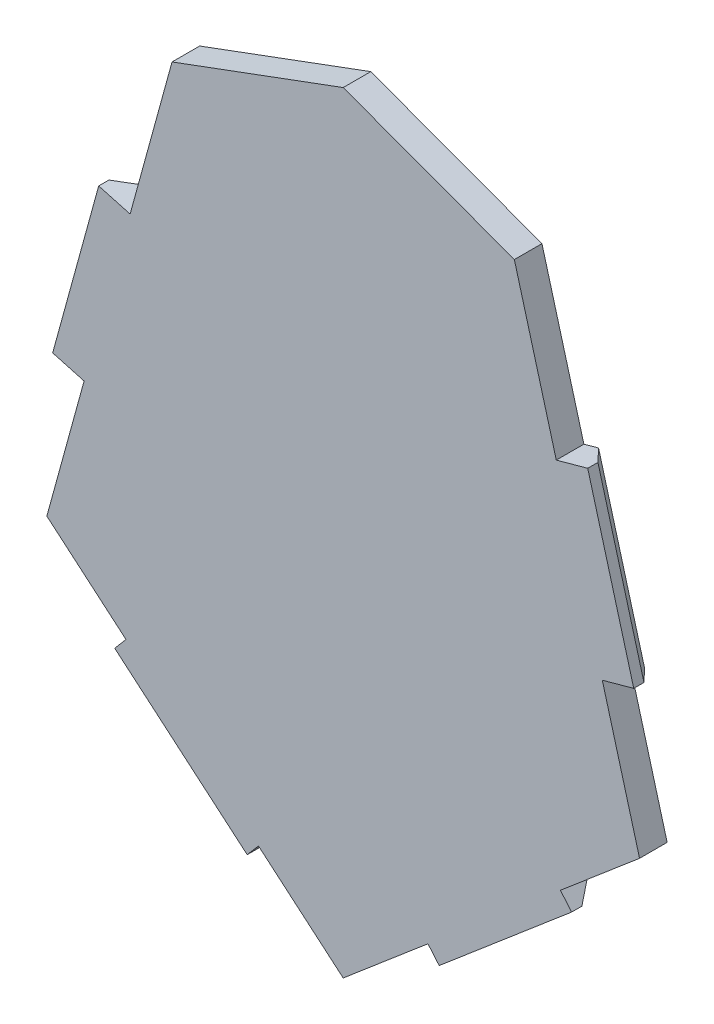
ISO-10303-21;
HEADER;
FILE_DESCRIPTION(('STEP AP214'),'2;1');
FILE_NAME('part.step','',(''),(''),'','','');
FILE_SCHEMA(('AUTOMOTIVE_DESIGN { 1 0 10303 214 1 1 1 1 }'));
ENDSEC;
DATA;
#1=APPLICATION_CONTEXT('core data for automotive mechanical design processes');
#2=APPLICATION_PROTOCOL_DEFINITION('international standard','automotive_design',2000,#1);
#3=PRODUCT_CONTEXT('',#1,'mechanical');
#4=PRODUCT('Part','Part','',(#3));
#5=PRODUCT_RELATED_PRODUCT_CATEGORY('part','',(#4));
#6=PRODUCT_DEFINITION_FORMATION('','',#4);
#7=PRODUCT_DEFINITION_CONTEXT('part definition',#1,'design');
#8=PRODUCT_DEFINITION('design','',#6,#7);
#9=PRODUCT_DEFINITION_SHAPE('','',#8);
#10=(LENGTH_UNIT() NAMED_UNIT(*) SI_UNIT(.MILLI.,.METRE.));
#11=(NAMED_UNIT(*) PLANE_ANGLE_UNIT() SI_UNIT($,.RADIAN.));
#12=(NAMED_UNIT(*) SI_UNIT($,.STERADIAN.) SOLID_ANGLE_UNIT());
#13=UNCERTAINTY_MEASURE_WITH_UNIT(LENGTH_MEASURE(1.E-05),#10,'distance_accuracy_value','');
#14=(GEOMETRIC_REPRESENTATION_CONTEXT(3) GLOBAL_UNCERTAINTY_ASSIGNED_CONTEXT((#13)) GLOBAL_UNIT_ASSIGNED_CONTEXT((#10,
#11,#12)) REPRESENTATION_CONTEXT('',''));
#15=CARTESIAN_POINT('',(0.,0.,0.));
#16=DIRECTION('',(0.,0.,1.));
#17=DIRECTION('',(1.,0.,0.));
#18=AXIS2_PLACEMENT_3D('',#15,#16,#17);
#19=CARTESIAN_POINT('',(15.7629121579827,-18.550858767251,3.175));
#20=DIRECTION('',(-0.647521590440071,0.762047104786811,0.));
#21=DIRECTION('',(-0.762047104786811,-0.647521590440071,0.));
#22=AXIS2_PLACEMENT_3D('',#19,#20,#21);
#23=PLANE('',#22);
#24=DIRECTION('',(0.762047104786811,0.647521590440071,0.));
#25=VECTOR('',#24,1.);
#26=CARTESIAN_POINT('',(15.7629121579827,-18.550858767251,3.175));
#27=LINE('',#26,#25);
#28=CARTESIAN_POINT('',(24.9920826937992,-10.7087094483235,3.175));
#29=VERTEX_POINT('',#28);
#30=CARTESIAN_POINT('',(34.0985455960016,-2.97082644256468,3.175));
#31=VERTEX_POINT('',#30);
#32=EDGE_CURVE('E530',#29,#31,#27,.T.);
#33=ORIENTED_EDGE('',*,*,#32,.F.);
#34=DIRECTION('',(0.,0.,-1.));
#35=VECTOR('',#34,1.);
#36=CARTESIAN_POINT('',(24.9920826937992,-10.7087094483235,3.175));
#37=LINE('',#36,#35);
#38=CARTESIAN_POINT('',(24.9920826937992,-10.7087094483235,0.));
#39=VERTEX_POINT('',#38);
#40=EDGE_CURVE('E308',#29,#39,#37,.T.);
#41=ORIENTED_EDGE('',*,*,#40,.T.);
#42=DIRECTION('',(0.762047104786811,0.647521590440071,0.));
#43=VECTOR('',#42,1.);
#44=CARTESIAN_POINT('',(15.7629121579827,-18.550858767251,0.));
#45=LINE('',#44,#43);
#46=CARTESIAN_POINT('',(34.0985455960016,-2.97082644256468,0.));
#47=VERTEX_POINT('',#46);
#48=EDGE_CURVE('E419',#39,#47,#45,.T.);
#49=ORIENTED_EDGE('',*,*,#48,.T.);
#50=DIRECTION('',(0.,0.,-1.));
#51=VECTOR('',#50,1.);
#52=CARTESIAN_POINT('',(34.0985455960016,-2.97082644256468,3.175));
#53=LINE('',#52,#51);
#54=EDGE_CURVE('E465',#31,#47,#53,.T.);
#55=ORIENTED_EDGE('',*,*,#54,.F.);
#56=EDGE_LOOP('',(#33,#41,#49,#55));
#57=FACE_BOUND('',#56,.T.);
#58=ADVANCED_FACE('F115',(#57),#23,.F.);
#59=CARTESIAN_POINT('',(-34.5651579868878,9.49162994769097,3.175));
#60=DIRECTION('',(0.964303674148378,-0.264798836900653,0.));
#61=DIRECTION('',(0.264798836900653,0.964303674148378,0.));
#62=AXIS2_PLACEMENT_3D('',#59,#60,#61);
#63=PLANE('',#62);
#64=DIRECTION('',(0.,0.,-1.));
#65=VECTOR('',#64,1.);
#66=CARTESIAN_POINT('',(-28.1332603745069,32.914325349076,3.175));
#67=LINE('',#66,#65);
#68=CARTESIAN_POINT('',(-28.1332603745069,32.914325349076,3.175));
#69=VERTEX_POINT('',#68);
#70=CARTESIAN_POINT('',(-28.1332603745069,32.914325349076,2.));
#71=VERTEX_POINT('',#70);
#72=EDGE_CURVE('E385',#69,#71,#67,.T.);
#73=ORIENTED_EDGE('',*,*,#72,.T.);
#74=DIRECTION('',(-0.264798836900653,-0.964303674148378,0.));
#75=VECTOR('',#74,1.);
#76=CARTESIAN_POINT('',(-34.5651579868878,9.49162994769097,2.));
#77=LINE('',#76,#75);
#78=CARTESIAN_POINT('',(-33.42923711252,13.6282518661085,2.));
#79=VERTEX_POINT('',#78);
#80=EDGE_CURVE('E302',#71,#79,#77,.T.);
#81=ORIENTED_EDGE('',*,*,#80,.T.);
#82=DIRECTION('',(0.,0.,-1.));
#83=VECTOR('',#82,1.);
#84=CARTESIAN_POINT('',(-33.42923711252,13.6282518661085,3.175));
#85=LINE('',#84,#83);
#86=CARTESIAN_POINT('',(-33.42923711252,13.6282518661085,3.175));
#87=VERTEX_POINT('',#86);
#88=EDGE_CURVE('E280',#87,#79,#85,.T.);
#89=ORIENTED_EDGE('',*,*,#88,.F.);
#90=DIRECTION('',(-0.264798836900653,-0.964303674148378,0.));
#91=VECTOR('',#90,1.);
#92=CARTESIAN_POINT('',(-34.5651579868878,9.49162994769097,3.175));
#93=LINE('',#92,#91);
#94=EDGE_CURVE('E287',#69,#87,#93,.T.);
#95=ORIENTED_EDGE('',*,*,#94,.F.);
#96=EDGE_LOOP('',(#73,#81,#89,#95));
#97=FACE_BOUND('',#96,.T.);
#98=ADVANCED_FACE('F300',(#97),#63,.F.);
#99=CARTESIAN_POINT('',(1.1359208743678,4.13662191841753,3.175));
#100=DIRECTION('',(0.264798836900652,0.964303674148378,0.));
#101=DIRECTION('',(-0.964303674148378,0.264798836900652,0.));
#102=AXIS2_PLACEMENT_3D('',#99,#100,#101);
#103=PLANE('',#102);
#104=ORIENTED_EDGE('',*,*,#88,.T.);
#105=DIRECTION('',(-0.681865667113421,0.187241053222761,0.707106781186548));
#106=VECTOR('',#105,1.);
#107=CARTESIAN_POINT('',(-33.42923711252,13.6282518661085,2.));
#108=LINE('',#107,#106);
#109=CARTESIAN_POINT('',(-31.5006297642232,13.0986541923072,0.));
#110=VERTEX_POINT('',#109);
#111=EDGE_CURVE('E373',#79,#110,#108,.F.);
#112=ORIENTED_EDGE('',*,*,#111,.T.);
#113=DIRECTION('',(0.964303674148378,-0.264798836900652,0.));
#114=VECTOR('',#113,1.);
#115=CARTESIAN_POINT('',(1.1359208743678,4.13662191841753,0.));
#116=LINE('',#115,#114);
#117=CARTESIAN_POINT('',(-29.8130983344636,12.635256227731,0.));
#118=VERTEX_POINT('',#117);
#119=EDGE_CURVE('E335',#110,#118,#116,.T.);
#120=ORIENTED_EDGE('',*,*,#119,.T.);
#121=DIRECTION('',(0.,0.,-1.));
#122=VECTOR('',#121,1.);
#123=CARTESIAN_POINT('',(-29.8130983344636,12.635256227731,3.175));
#124=LINE('',#123,#122);
#125=CARTESIAN_POINT('',(-29.8130983344636,12.635256227731,3.175));
#126=VERTEX_POINT('',#125);
#127=EDGE_CURVE('E282',#126,#118,#124,.T.);
#128=ORIENTED_EDGE('',*,*,#127,.F.);
#129=DIRECTION('',(0.964303674148378,-0.264798836900652,0.));
#130=VECTOR('',#129,1.);
#131=CARTESIAN_POINT('',(1.1359208743678,4.13662191841753,3.175));
#132=LINE('',#131,#130);
#133=EDGE_CURVE('E276',#87,#126,#132,.T.);
#134=ORIENTED_EDGE('',*,*,#133,.F.);
#135=EDGE_LOOP('',(#104,#112,#120,#128,#134));
#136=FACE_BOUND('',#135,.T.);
#137=ADVANCED_FACE('F278',(#136),#103,.F.);
#138=CARTESIAN_POINT('',(-30.9490192088314,8.49863430931353,3.175));
#139=DIRECTION('',(0.964303674148378,-0.264798836900653,0.));
#140=DIRECTION('',(0.264798836900653,0.964303674148378,0.));
#141=AXIS2_PLACEMENT_3D('',#138,#139,#140);
#142=PLANE('',#141);
#143=DIRECTION('',(-0.264798836900653,-0.964303674148378,0.));
#144=VECTOR('',#143,1.);
#145=CARTESIAN_POINT('',(-30.9490192088314,8.49863430931353,0.));
#146=LINE('',#145,#144);
#147=CARTESIAN_POINT('',(-34.0985455960013,-2.97082644256537,0.));
#148=VERTEX_POINT('',#147);
#149=EDGE_CURVE('E400',#118,#148,#146,.T.);
#150=ORIENTED_EDGE('',*,*,#149,.T.);
#151=DIRECTION('',(0.,0.,-1.));
#152=VECTOR('',#151,1.);
#153=CARTESIAN_POINT('',(-34.0985455960013,-2.97082644256537,3.175));
#154=LINE('',#153,#152);
#155=CARTESIAN_POINT('',(-34.0985455960013,-2.97082644256537,3.175));
#156=VERTEX_POINT('',#155);
#157=EDGE_CURVE('E310',#156,#148,#154,.T.);
#158=ORIENTED_EDGE('',*,*,#157,.F.);
#159=DIRECTION('',(-0.264798836900653,-0.964303674148378,0.));
#160=VECTOR('',#159,1.);
#161=CARTESIAN_POINT('',(-30.9490192088314,8.49863430931353,3.175));
#162=LINE('',#161,#160);
#163=EDGE_CURVE('E286',#126,#156,#162,.T.);
#164=ORIENTED_EDGE('',*,*,#163,.F.);
#165=ORIENTED_EDGE('',*,*,#127,.T.);
#166=EDGE_LOOP('',(#150,#158,#164,#165));
#167=FACE_BOUND('',#166,.T.);
#168=ADVANCED_FACE('F648',(#167),#142,.F.);
#169=CARTESIAN_POINT('',(-15.7629121579826,-18.5508587672513,3.175));
#170=DIRECTION('',(0.647521590440065,0.762047104786816,0.));
#171=DIRECTION('',(-0.762047104786816,0.647521590440065,0.));
#172=AXIS2_PLACEMENT_3D('',#169,#170,#171);
#173=PLANE('',#172);
#174=DIRECTION('',(0.762047104786816,-0.647521590440065,0.));
#175=VECTOR('',#174,1.);
#176=CARTESIAN_POINT('',(-15.7629121579826,-18.5508587672513,0.));
#177=LINE('',#176,#175);
#178=CARTESIAN_POINT('',(-24.9920826937988,-10.7087094483241,0.));
#179=VERTEX_POINT('',#178);
#180=EDGE_CURVE('E404',#148,#179,#177,.T.);
#181=ORIENTED_EDGE('',*,*,#180,.T.);
#182=DIRECTION('',(0.,0.,-1.));
#183=VECTOR('',#182,1.);
#184=CARTESIAN_POINT('',(-24.9920826937988,-10.7087094483241,3.175));
#185=LINE('',#184,#183);
#186=CARTESIAN_POINT('',(-24.9920826937988,-10.7087094483241,3.175));
#187=VERTEX_POINT('',#186);
#188=EDGE_CURVE('E485',#187,#179,#185,.T.);
#189=ORIENTED_EDGE('',*,*,#188,.F.);
#190=DIRECTION('',(0.762047104786816,-0.647521590440065,0.));
#191=VECTOR('',#190,1.);
#192=CARTESIAN_POINT('',(-15.7629121579826,-18.5508587672513,3.175));
#193=LINE('',#192,#191);
#194=EDGE_CURVE('E495',#156,#187,#193,.T.);
#195=ORIENTED_EDGE('',*,*,#194,.F.);
#196=ORIENTED_EDGE('',*,*,#157,.T.);
#197=EDGE_LOOP('',(#181,#189,#195,#196));
#198=FACE_BOUND('',#197,.T.);
#199=ADVANCED_FACE('F493',(#198),#173,.F.);
#200=CARTESIAN_POINT('',(-9.22917053581629,7.84214931892713,3.175));
#201=DIRECTION('',(0.762047104786818,-0.647521590440063,0.));
#202=DIRECTION('',(0.647521590440063,0.762047104786818,0.));
#203=AXIS2_PLACEMENT_3D('',#200,#201,#202);
#204=PLANE('',#203);
#205=ORIENTED_EDGE('',*,*,#188,.T.);
#206=DIRECTION('',(0.457866907564868,0.538848675378336,-0.707106781186546));
#207=VECTOR('',#206,1.);
#208=CARTESIAN_POINT('',(-26.287125874679,-12.2328036578978,1.99999999999999));
#209=LINE('',#208,#207);
#210=CARTESIAN_POINT('',(-26.287125874679,-12.2328036578979,2.));
#211=VERTEX_POINT('',#210);
#212=EDGE_CURVE('E368',#179,#211,#209,.F.);
#213=ORIENTED_EDGE('',*,*,#212,.T.);
#214=DIRECTION('',(0.,0.,-1.));
#215=VECTOR('',#214,1.);
#216=CARTESIAN_POINT('',(-26.287125874679,-12.2328036578979,3.175));
#217=LINE('',#216,#215);
#218=CARTESIAN_POINT('',(-26.287125874679,-12.2328036578979,3.175));
#219=VERTEX_POINT('',#218);
#220=EDGE_CURVE('E481',#219,#211,#217,.T.);
#221=ORIENTED_EDGE('',*,*,#220,.F.);
#222=DIRECTION('',(-0.647521590440063,-0.762047104786818,0.));
#223=VECTOR('',#222,1.);
#224=CARTESIAN_POINT('',(-9.22917053581629,7.84214931892713,3.175));
#225=LINE('',#224,#223);
#226=EDGE_CURVE('E516',#187,#219,#225,.T.);
#227=ORIENTED_EDGE('',*,*,#226,.F.);
#228=EDGE_LOOP('',(#205,#213,#221,#227));
#229=FACE_BOUND('',#228,.T.);
#230=ADVANCED_FACE('F506',(#229),#204,.F.);
#231=CARTESIAN_POINT('',(-17.0579553388627,-20.074952976825,3.175));
#232=DIRECTION('',(0.647521590440062,0.762047104786819,0.));
#233=DIRECTION('',(-0.762047104786819,0.647521590440062,0.));
#234=AXIS2_PLACEMENT_3D('',#231,#232,#233);
#235=PLANE('',#234);
#236=ORIENTED_EDGE('',*,*,#220,.T.);
#237=DIRECTION('',(0.762047104786819,-0.647521590440062,0.));
#238=VECTOR('',#237,1.);
#239=CARTESIAN_POINT('',(-17.0579553388627,-20.074952976825,2.));
#240=LINE('',#239,#238);
#241=CARTESIAN_POINT('',(-11.0461837789427,-25.1832354666991,2.));
#242=VERTEX_POINT('',#241);
#243=EDGE_CURVE('E361',#211,#242,#240,.T.);
#244=ORIENTED_EDGE('',*,*,#243,.T.);
#245=DIRECTION('',(0.,0.,-1.));
#246=VECTOR('',#245,1.);
#247=CARTESIAN_POINT('',(-11.0461837789427,-25.1832354666991,3.175));
#248=LINE('',#247,#246);
#249=CARTESIAN_POINT('',(-11.0461837789427,-25.1832354666991,3.175));
#250=VERTEX_POINT('',#249);
#251=EDGE_CURVE('E477',#250,#242,#248,.T.);
#252=ORIENTED_EDGE('',*,*,#251,.F.);
#253=DIRECTION('',(0.762047104786819,-0.647521590440062,0.));
#254=VECTOR('',#253,1.);
#255=CARTESIAN_POINT('',(-17.0579553388627,-20.074952976825,3.175));
#256=LINE('',#255,#254);
#257=EDGE_CURVE('E512',#219,#250,#256,.T.);
#258=ORIENTED_EDGE('',*,*,#257,.F.);
#259=EDGE_LOOP('',(#236,#244,#252,#258));
#260=FACE_BOUND('',#259,.T.);
#261=ADVANCED_FACE('F510',(#260),#235,.F.);
#262=CARTESIAN_POINT('',(6.01177155992005,-5.10828248987412,3.175));
#263=DIRECTION('',(-0.762047104786818,0.647521590440063,0.));
#264=DIRECTION('',(-0.647521590440063,-0.762047104786818,0.));
#265=AXIS2_PLACEMENT_3D('',#262,#263,#264);
#266=PLANE('',#265);
#267=ORIENTED_EDGE('',*,*,#251,.T.);
#268=DIRECTION('',(-0.457866907564868,-0.538848675378336,0.707106781186546));
#269=VECTOR('',#268,1.);
#270=CARTESIAN_POINT('',(-11.0461837789427,-25.1832354666991,2.00000000000001));
#271=LINE('',#270,#269);
#272=CARTESIAN_POINT('',(-9.75114059806253,-23.6591412571254,0.));
#273=VERTEX_POINT('',#272);
#274=EDGE_CURVE('E365',#242,#273,#271,.F.);
#275=ORIENTED_EDGE('',*,*,#274,.T.);
#276=DIRECTION('',(0.,0.,-1.));
#277=VECTOR('',#276,1.);
#278=CARTESIAN_POINT('',(-9.75114059806253,-23.6591412571254,3.175));
#279=LINE('',#278,#277);
#280=CARTESIAN_POINT('',(-9.75114059806253,-23.6591412571254,3.175));
#281=VERTEX_POINT('',#280);
#282=EDGE_CURVE('E473',#281,#273,#279,.T.);
#283=ORIENTED_EDGE('',*,*,#282,.F.);
#284=DIRECTION('',(0.647521590440063,0.762047104786818,0.));
#285=VECTOR('',#284,1.);
#286=CARTESIAN_POINT('',(6.01177155992005,-5.10828248987412,3.175));
#287=LINE('',#286,#285);
#288=EDGE_CURVE('E515',#250,#281,#287,.T.);
#289=ORIENTED_EDGE('',*,*,#288,.F.);
#290=EDGE_LOOP('',(#267,#275,#283,#289));
#291=FACE_BOUND('',#290,.T.);
#292=ADVANCED_FACE('F665',(#291),#266,.F.);
#293=CARTESIAN_POINT('',(0.,-31.944815500883,0.));
#294=VERTEX_POINT('',#293);
#295=EDGE_CURVE('E413',#273,#294,#177,.T.);
#296=ORIENTED_EDGE('',*,*,#295,.T.);
#297=DIRECTION('',(0.,0.,-1.));
#298=VECTOR('',#297,1.);
#299=CARTESIAN_POINT('',(0.,-31.944815500883,3.175));
#300=LINE('',#299,#298);
#301=CARTESIAN_POINT('',(0.,-31.944815500883,3.175));
#302=VERTEX_POINT('',#301);
#303=EDGE_CURVE('E469',#302,#294,#300,.T.);
#304=ORIENTED_EDGE('',*,*,#303,.F.);
#305=EDGE_CURVE('E520',#281,#302,#193,.T.);
#306=ORIENTED_EDGE('',*,*,#305,.F.);
#307=ORIENTED_EDGE('',*,*,#282,.T.);
#308=EDGE_LOOP('',(#296,#304,#306,#307));
#309=FACE_BOUND('',#308,.T.);
#310=ADVANCED_FACE('F608',(#309),#173,.F.);
#311=CARTESIAN_POINT('',(9.75114059806294,-23.659141257125,0.));
#312=VERTEX_POINT('',#311);
#313=EDGE_CURVE('E414',#294,#312,#45,.T.);
#314=ORIENTED_EDGE('',*,*,#313,.T.);
#315=DIRECTION('',(0.,0.,1.));
#316=VECTOR('',#315,1.);
#317=CARTESIAN_POINT('',(9.75114059806294,-23.659141257125,3.175));
#318=LINE('',#317,#316);
#319=CARTESIAN_POINT('',(9.75114059806294,-23.659141257125,3.175));
#320=VERTEX_POINT('',#319);
#321=EDGE_CURVE('E304',#312,#320,#318,.T.);
#322=ORIENTED_EDGE('',*,*,#321,.T.);
#323=EDGE_CURVE('E525',#302,#320,#27,.T.);
#324=ORIENTED_EDGE('',*,*,#323,.F.);
#325=ORIENTED_EDGE('',*,*,#303,.T.);
#326=EDGE_LOOP('',(#314,#322,#324,#325));
#327=FACE_BOUND('',#326,.T.);
#328=ADVANCED_FACE('F612',(#327),#23,.F.);
#329=CARTESIAN_POINT('',(30.9490192088316,8.49863430931387,3.175));
#330=DIRECTION('',(-0.964303674148376,-0.264798836900661,0.));
#331=DIRECTION('',(0.264798836900661,-0.964303674148376,0.));
#332=AXIS2_PLACEMENT_3D('',#329,#330,#331);
#333=PLANE('',#332);
#334=DIRECTION('',(-0.264798836900661,0.964303674148376,0.));
#335=VECTOR('',#334,1.);
#336=CARTESIAN_POINT('',(30.9490192088316,8.49863430931387,0.));
#337=LINE('',#336,#335);
#338=CARTESIAN_POINT('',(29.8130983344639,12.6352562277311,0.));
#339=VERTEX_POINT('',#338);
#340=EDGE_CURVE('E418',#47,#339,#337,.T.);
#341=ORIENTED_EDGE('',*,*,#340,.T.);
#342=DIRECTION('',(0.,0.,-1.));
#343=VECTOR('',#342,1.);
#344=CARTESIAN_POINT('',(29.8130983344639,12.6352562277311,3.175));
#345=LINE('',#344,#343);
#346=CARTESIAN_POINT('',(29.8130983344639,12.6352562277311,3.175));
#347=VERTEX_POINT('',#346);
#348=EDGE_CURVE('E461',#347,#339,#345,.T.);
#349=ORIENTED_EDGE('',*,*,#348,.F.);
#350=DIRECTION('',(-0.264798836900661,0.964303674148376,0.));
#351=VECTOR('',#350,1.);
#352=CARTESIAN_POINT('',(30.9490192088316,8.49863430931387,3.175));
#353=LINE('',#352,#351);
#354=EDGE_CURVE('E529',#31,#347,#353,.T.);
#355=ORIENTED_EDGE('',*,*,#354,.F.);
#356=ORIENTED_EDGE('',*,*,#54,.T.);
#357=EDGE_LOOP('',(#341,#349,#355,#356));
#358=FACE_BOUND('',#357,.T.);
#359=ADVANCED_FACE('F576',(#358),#333,.F.);
#360=CARTESIAN_POINT('',(-1.13592087436775,4.13662191841722,3.175));
#361=DIRECTION('',(0.264798836900661,-0.964303674148376,0.));
#362=DIRECTION('',(0.964303674148376,0.264798836900661,0.));
#363=AXIS2_PLACEMENT_3D('',#360,#361,#362);
#364=PLANE('',#363);
#365=DIRECTION('',(-0.964303674148376,-0.264798836900661,0.));
#366=VECTOR('',#365,1.);
#367=CARTESIAN_POINT('',(-1.13592087436775,4.13662191841722,0.));
#368=LINE('',#367,#366);
#369=CARTESIAN_POINT('',(31.5006297642235,13.0986541923073,0.));
#370=VERTEX_POINT('',#369);
#371=EDGE_CURVE('E423',#370,#339,#368,.T.);
#372=ORIENTED_EDGE('',*,*,#371,.F.);
#373=DIRECTION('',(0.681865667113417,0.187241053222767,0.70710678118655));
#374=VECTOR('',#373,1.);
#375=CARTESIAN_POINT('',(16.7131865276386,9.03800620894209,-15.3348407073577));
#376=LINE('',#375,#374);
#377=CARTESIAN_POINT('',(33.4292371125203,13.6282518661086,2.00000000000002));
#378=VERTEX_POINT('',#377);
#379=EDGE_CURVE('E139',#370,#378,#376,.T.);
#380=ORIENTED_EDGE('',*,*,#379,.T.);
#381=DIRECTION('',(0.,0.,-1.));
#382=VECTOR('',#381,1.);
#383=CARTESIAN_POINT('',(33.4292371125203,13.6282518661086,3.175));
#384=LINE('',#383,#382);
#385=CARTESIAN_POINT('',(33.4292371125203,13.6282518661086,3.175));
#386=VERTEX_POINT('',#385);
#387=EDGE_CURVE('E458',#386,#378,#384,.T.);
#388=ORIENTED_EDGE('',*,*,#387,.F.);
#389=DIRECTION('',(-0.964303674148376,-0.264798836900661,0.));
#390=VECTOR('',#389,1.);
#391=CARTESIAN_POINT('',(-1.13592087436775,4.13662191841722,3.175));
#392=LINE('',#391,#390);
#393=EDGE_CURVE('E533',#386,#347,#392,.T.);
#394=ORIENTED_EDGE('',*,*,#393,.T.);
#395=ORIENTED_EDGE('',*,*,#348,.T.);
#396=EDGE_LOOP('',(#372,#380,#388,#394,#395));
#397=FACE_BOUND('',#396,.T.);
#398=ADVANCED_FACE('F577',(#397),#364,.T.);
#399=CARTESIAN_POINT('',(34.565157986888,9.49162994769134,3.175));
#400=DIRECTION('',(0.964303674148376,0.26479883690066,0.));
#401=DIRECTION('',(-0.26479883690066,0.964303674148376,0.));
#402=AXIS2_PLACEMENT_3D('',#399,#400,#401);
#403=PLANE('',#402);
#404=ORIENTED_EDGE('',*,*,#387,.T.);
#405=DIRECTION('',(-0.26479883690066,0.964303674148376,0.));
#406=VECTOR('',#405,1.);
#407=CARTESIAN_POINT('',(28.1332603745071,32.9143253490761,2.00000000000002));
#408=LINE('',#407,#406);
#409=CARTESIAN_POINT('',(28.1332603745071,32.9143253490761,2.00000000000002));
#410=VERTEX_POINT('',#409);
#411=EDGE_CURVE('E125',#378,#410,#408,.T.);
#412=ORIENTED_EDGE('',*,*,#411,.T.);
#413=DIRECTION('',(0.,0.,-1.));
#414=VECTOR('',#413,1.);
#415=CARTESIAN_POINT('',(28.1332603745071,32.9143253490761,3.175));
#416=LINE('',#415,#414);
#417=CARTESIAN_POINT('',(28.1332603745071,32.9143253490761,3.175));
#418=VERTEX_POINT('',#417);
#419=EDGE_CURVE('E455',#418,#410,#416,.T.);
#420=ORIENTED_EDGE('',*,*,#419,.F.);
#421=DIRECTION('',(0.26479883690066,-0.964303674148376,0.));
#422=VECTOR('',#421,1.);
#423=CARTESIAN_POINT('',(34.565157986888,9.49162994769134,3.175));
#424=LINE('',#423,#422);
#425=EDGE_CURVE('E538',#418,#386,#424,.T.);
#426=ORIENTED_EDGE('',*,*,#425,.T.);
#427=EDGE_LOOP('',(#404,#412,#420,#426));
#428=FACE_BOUND('',#427,.T.);
#429=ADVANCED_FACE('F580',(#428),#403,.T.);
#430=CARTESIAN_POINT('',(-6.431897612381,23.4226954013847,3.175));
#431=DIRECTION('',(-0.264798836900662,0.964303674148375,0.));
#432=DIRECTION('',(-0.964303674148376,-0.264798836900662,0.));
#433=AXIS2_PLACEMENT_3D('',#430,#431,#432);
#434=PLANE('',#433);
#435=ORIENTED_EDGE('',*,*,#419,.T.);
#436=DIRECTION('',(-0.681865667113416,-0.187241053222768,-0.70710678118655));
#437=VECTOR('',#436,1.);
#438=CARTESIAN_POINT('',(11.4172097896253,28.3240796919096,-15.3348407073577));
#439=LINE('',#438,#437);
#440=CARTESIAN_POINT('',(26.2046530262103,32.3847276752748,0.));
#441=VERTEX_POINT('',#440);
#442=EDGE_CURVE('E12',#410,#441,#439,.T.);
#443=ORIENTED_EDGE('',*,*,#442,.T.);
#444=DIRECTION('',(0.964303674148376,0.264798836900662,0.));
#445=VECTOR('',#444,1.);
#446=CARTESIAN_POINT('',(-6.431897612381,23.4226954013847,0.));
#447=LINE('',#446,#445);
#448=CARTESIAN_POINT('',(24.5171215964507,31.9213297106986,0.));
#449=VERTEX_POINT('',#448);
#450=EDGE_CURVE('E427',#449,#441,#447,.T.);
#451=ORIENTED_EDGE('',*,*,#450,.F.);
#452=DIRECTION('',(0.,0.,-1.));
#453=VECTOR('',#452,1.);
#454=CARTESIAN_POINT('',(24.5171215964507,31.9213297106986,3.175));
#455=LINE('',#454,#453);
#456=CARTESIAN_POINT('',(24.5171215964507,31.9213297106986,3.175));
#457=VERTEX_POINT('',#456);
#458=EDGE_CURVE('E452',#457,#449,#455,.T.);
#459=ORIENTED_EDGE('',*,*,#458,.F.);
#460=DIRECTION('',(0.964303674148376,0.264798836900662,0.));
#461=VECTOR('',#460,1.);
#462=CARTESIAN_POINT('',(-6.431897612381,23.4226954013847,3.175));
#463=LINE('',#462,#461);
#464=EDGE_CURVE('E542',#457,#418,#463,.T.);
#465=ORIENTED_EDGE('',*,*,#464,.T.);
#466=EDGE_LOOP('',(#435,#443,#451,#459,#465));
#467=FACE_BOUND('',#466,.T.);
#468=ADVANCED_FACE('F583',(#467),#434,.T.);
#469=CARTESIAN_POINT('',(19.6924867881206,49.490942653682,0.));
#470=VERTEX_POINT('',#469);
#471=EDGE_CURVE('E424',#449,#470,#337,.T.);
#472=ORIENTED_EDGE('',*,*,#471,.T.);
#473=DIRECTION('',(0.,0.,-1.));
#474=VECTOR('',#473,1.);
#475=CARTESIAN_POINT('',(19.6924867881206,49.490942653682,3.175));
#476=LINE('',#475,#474);
#477=CARTESIAN_POINT('',(19.6924867881206,49.490942653682,3.175));
#478=VERTEX_POINT('',#477);
#479=EDGE_CURVE('E449',#478,#470,#476,.T.);
#480=ORIENTED_EDGE('',*,*,#479,.F.);
#481=EDGE_CURVE('E534',#457,#478,#353,.T.);
#482=ORIENTED_EDGE('',*,*,#481,.F.);
#483=ORIENTED_EDGE('',*,*,#458,.T.);
#484=EDGE_LOOP('',(#472,#480,#482,#483));
#485=FACE_BOUND('',#484,.T.);
#486=ADVANCED_FACE('F592',(#485),#333,.F.);
#487=CARTESIAN_POINT('',(18.4959725846933,49.9341403089706,3.175));
#488=DIRECTION('',(0.347344849782617,0.937737466100982,0.));
#489=DIRECTION('',(-0.937737466100983,0.347344849782617,0.));
#490=AXIS2_PLACEMENT_3D('',#487,#488,#489);
#491=PLANE('',#490);
#492=DIRECTION('',(0.937737466100982,-0.347344849782617,0.));
#493=VECTOR('',#492,1.);
#494=CARTESIAN_POINT('',(18.4959725846933,49.9341403089706,0.));
#495=LINE('',#494,#493);
#496=CARTESIAN_POINT('',(0.,56.785184499117,0.));
#497=VERTEX_POINT('',#496);
#498=EDGE_CURVE('E431',#497,#470,#495,.T.);
#499=ORIENTED_EDGE('',*,*,#498,.F.);
#500=DIRECTION('',(0.,0.,-1.));
#501=VECTOR('',#500,1.);
#502=CARTESIAN_POINT('',(0.,56.785184499117,3.175));
#503=LINE('',#502,#501);
#504=CARTESIAN_POINT('',(0.,56.785184499117,3.175));
#505=VERTEX_POINT('',#504);
#506=EDGE_CURVE('E446',#505,#497,#503,.T.);
#507=ORIENTED_EDGE('',*,*,#506,.F.);
#508=DIRECTION('',(0.937737466100982,-0.347344849782617,0.));
#509=VECTOR('',#508,1.);
#510=CARTESIAN_POINT('',(18.4959725846933,49.9341403089706,3.175));
#511=LINE('',#510,#509);
#512=EDGE_CURVE('E546',#505,#478,#511,.T.);
#513=ORIENTED_EDGE('',*,*,#512,.T.);
#514=ORIENTED_EDGE('',*,*,#479,.T.);
#515=EDGE_LOOP('',(#499,#507,#513,#514));
#516=FACE_BOUND('',#515,.T.);
#517=ADVANCED_FACE('F596',(#516),#491,.T.);
#518=CARTESIAN_POINT('',(-18.4959725846933,49.9341403089706,3.175));
#519=DIRECTION('',(0.347344849782617,-0.937737466100982,0.));
#520=DIRECTION('',(0.937737466100983,0.347344849782617,0.));
#521=AXIS2_PLACEMENT_3D('',#518,#519,#520);
#522=PLANE('',#521);
#523=DIRECTION('',(-0.937737466100982,-0.347344849782617,0.));
#524=VECTOR('',#523,1.);
#525=CARTESIAN_POINT('',(-18.4959725846933,49.9341403089706,0.));
#526=LINE('',#525,#524);
#527=CARTESIAN_POINT('',(-19.6924867881206,49.490942653682,0.));
#528=VERTEX_POINT('',#527);
#529=EDGE_CURVE('E435',#497,#528,#526,.T.);
#530=ORIENTED_EDGE('',*,*,#529,.T.);
#531=DIRECTION('',(0.,0.,-1.));
#532=VECTOR('',#531,1.);
#533=CARTESIAN_POINT('',(-19.6924867881206,49.490942653682,3.175));
#534=LINE('',#533,#532);
#535=CARTESIAN_POINT('',(-19.6924867881206,49.490942653682,3.175));
#536=VERTEX_POINT('',#535);
#537=EDGE_CURVE('E442',#536,#528,#534,.T.);
#538=ORIENTED_EDGE('',*,*,#537,.F.);
#539=DIRECTION('',(-0.937737466100982,-0.347344849782617,0.));
#540=VECTOR('',#539,1.);
#541=CARTESIAN_POINT('',(-18.4959725846933,49.9341403089706,3.175));
#542=LINE('',#541,#540);
#543=EDGE_CURVE('E549',#505,#536,#542,.T.);
#544=ORIENTED_EDGE('',*,*,#543,.F.);
#545=ORIENTED_EDGE('',*,*,#506,.T.);
#546=EDGE_LOOP('',(#530,#538,#544,#545));
#547=FACE_BOUND('',#546,.T.);
#548=ADVANCED_FACE('F599',(#547),#522,.F.);
#549=CARTESIAN_POINT('',(-24.5171215964505,31.9213297106986,0.));
#550=VERTEX_POINT('',#549);
#551=EDGE_CURVE('E406',#528,#550,#146,.T.);
#552=ORIENTED_EDGE('',*,*,#551,.T.);
#553=DIRECTION('',(0.,0.,-1.));
#554=VECTOR('',#553,1.);
#555=CARTESIAN_POINT('',(-24.5171215964505,31.9213297106986,3.175));
#556=LINE('',#555,#554);
#557=CARTESIAN_POINT('',(-24.5171215964505,31.9213297106986,3.175));
#558=VERTEX_POINT('',#557);
#559=EDGE_CURVE('E391',#558,#550,#556,.T.);
#560=ORIENTED_EDGE('',*,*,#559,.F.);
#561=EDGE_CURVE('E551',#536,#558,#162,.T.);
#562=ORIENTED_EDGE('',*,*,#561,.F.);
#563=ORIENTED_EDGE('',*,*,#537,.T.);
#564=EDGE_LOOP('',(#552,#560,#562,#563));
#565=FACE_BOUND('',#564,.T.);
#566=ADVANCED_FACE('F602',(#565),#142,.F.);
#567=CARTESIAN_POINT('',(6.43189761238083,23.4226954013851,3.175));
#568=DIRECTION('',(-0.264798836900652,-0.964303674148378,0.));
#569=DIRECTION('',(0.964303674148378,-0.264798836900652,0.));
#570=AXIS2_PLACEMENT_3D('',#567,#568,#569);
#571=PLANE('',#570);
#572=DIRECTION('',(-0.964303674148378,0.264798836900652,0.));
#573=VECTOR('',#572,1.);
#574=CARTESIAN_POINT('',(6.43189761238083,23.4226954013851,0.));
#575=LINE('',#574,#573);
#576=CARTESIAN_POINT('',(-26.2046530262102,32.3847276752747,0.));
#577=VERTEX_POINT('',#576);
#578=EDGE_CURVE('E297',#550,#577,#575,.T.);
#579=ORIENTED_EDGE('',*,*,#578,.T.);
#580=DIRECTION('',(0.681865667113421,-0.187241053222761,-0.707106781186548));
#581=VECTOR('',#580,1.);
#582=CARTESIAN_POINT('',(-28.133260374507,32.914325349076,2.00000000000001));
#583=LINE('',#582,#581);
#584=EDGE_CURVE('E376',#577,#71,#583,.F.);
#585=ORIENTED_EDGE('',*,*,#584,.T.);
#586=ORIENTED_EDGE('',*,*,#72,.F.);
#587=DIRECTION('',(-0.964303674148378,0.264798836900652,0.));
#588=VECTOR('',#587,1.);
#589=CARTESIAN_POINT('',(6.43189761238083,23.4226954013851,3.175));
#590=LINE('',#589,#588);
#591=EDGE_CURVE('E292',#558,#69,#590,.T.);
#592=ORIENTED_EDGE('',*,*,#591,.F.);
#593=ORIENTED_EDGE('',*,*,#559,.T.);
#594=EDGE_LOOP('',(#579,#585,#586,#592,#593));
#595=FACE_BOUND('',#594,.T.);
#596=ADVANCED_FACE('F384',(#595),#571,.F.);
#597=CARTESIAN_POINT('',(0.,0.,3.175));
#598=DIRECTION('',(0.,0.,1.));
#599=DIRECTION('',(1.,0.,0.));
#600=AXIS2_PLACEMENT_3D('',#597,#598,#599);
#601=PLANE('',#600);
#602=ORIENTED_EDGE('',*,*,#94,.T.);
#603=ORIENTED_EDGE('',*,*,#133,.T.);
#604=ORIENTED_EDGE('',*,*,#163,.T.);
#605=ORIENTED_EDGE('',*,*,#194,.T.);
#606=ORIENTED_EDGE('',*,*,#226,.T.);
#607=ORIENTED_EDGE('',*,*,#257,.T.);
#608=ORIENTED_EDGE('',*,*,#288,.T.);
#609=ORIENTED_EDGE('',*,*,#305,.T.);
#610=ORIENTED_EDGE('',*,*,#323,.T.);
#611=DIRECTION('',(-0.647521590440069,0.762047104786812,0.));
#612=VECTOR('',#611,1.);
#613=CARTESIAN_POINT('',(11.0461837789435,-25.183235466699,3.175));
#614=LINE('',#613,#612);
#615=CARTESIAN_POINT('',(11.0461837789435,-25.183235466699,3.175));
#616=VERTEX_POINT('',#615);
#617=EDGE_CURVE('E326',#616,#320,#614,.T.);
#618=ORIENTED_EDGE('',*,*,#617,.F.);
#619=DIRECTION('',(-0.762047104786811,-0.647521590440071,0.));
#620=VECTOR('',#619,1.);
#621=CARTESIAN_POINT('',(26.2871258746797,-12.2328036578976,3.175));
#622=LINE('',#621,#620);
#623=CARTESIAN_POINT('',(26.2871258746797,-12.2328036578976,3.175));
#624=VERTEX_POINT('',#623);
#625=EDGE_CURVE('E322',#624,#616,#622,.T.);
#626=ORIENTED_EDGE('',*,*,#625,.F.);
#627=DIRECTION('',(0.64752159044007,-0.762047104786812,0.));
#628=VECTOR('',#627,1.);
#629=CARTESIAN_POINT('',(24.9920826937992,-10.7087094483235,3.175));
#630=LINE('',#629,#628);
#631=EDGE_CURVE('E318',#29,#624,#630,.T.);
#632=ORIENTED_EDGE('',*,*,#631,.F.);
#633=ORIENTED_EDGE('',*,*,#32,.T.);
#634=ORIENTED_EDGE('',*,*,#354,.T.);
#635=ORIENTED_EDGE('',*,*,#393,.F.);
#636=ORIENTED_EDGE('',*,*,#425,.F.);
#637=ORIENTED_EDGE('',*,*,#464,.F.);
#638=ORIENTED_EDGE('',*,*,#481,.T.);
#639=ORIENTED_EDGE('',*,*,#512,.F.);
#640=ORIENTED_EDGE('',*,*,#543,.T.);
#641=ORIENTED_EDGE('',*,*,#561,.T.);
#642=ORIENTED_EDGE('',*,*,#591,.T.);
#643=EDGE_LOOP('',(#602,#603,#604,#605,#606,#607,#608,#609,#610,#618,#626,#632,#633,#634,#635,
#636,#637,#638,#639,#640,#641,#642));
#644=FACE_BOUND('',#643,.T.);
#645=ADVANCED_FACE('F290',(#644),#601,.T.);
#646=CARTESIAN_POINT('',(0.,0.,0.));
#647=DIRECTION('',(0.,0.,1.));
#648=DIRECTION('',(1.,0.,0.));
#649=AXIS2_PLACEMENT_3D('',#646,#647,#648);
#650=PLANE('',#649);
#651=ORIENTED_EDGE('',*,*,#48,.F.);
#652=DIRECTION('',(-0.762047104786811,-0.647521590440071,0.));
#653=VECTOR('',#652,1.);
#654=CARTESIAN_POINT('',(9.75114059806331,-23.6591412571254,0.));
#655=LINE('',#654,#653);
#656=EDGE_CURVE('E348',#39,#312,#655,.T.);
#657=ORIENTED_EDGE('',*,*,#656,.T.);
#658=ORIENTED_EDGE('',*,*,#313,.F.);
#659=ORIENTED_EDGE('',*,*,#295,.F.);
#660=DIRECTION('',(-0.762047104786819,0.647521590440062,0.));
#661=VECTOR('',#660,1.);
#662=CARTESIAN_POINT('',(-15.7629121579826,-18.5508587672513,0.));
#663=LINE('',#662,#661);
#664=EDGE_CURVE('E345',#273,#179,#663,.T.);
#665=ORIENTED_EDGE('',*,*,#664,.T.);
#666=ORIENTED_EDGE('',*,*,#180,.F.);
#667=ORIENTED_EDGE('',*,*,#149,.F.);
#668=ORIENTED_EDGE('',*,*,#119,.F.);
#669=DIRECTION('',(0.264798836900653,0.964303674148378,0.));
#670=VECTOR('',#669,1.);
#671=CARTESIAN_POINT('',(-32.636550638591,8.96203227388967,0.));
#672=LINE('',#671,#670);
#673=EDGE_CURVE('E342',#110,#577,#672,.T.);
#674=ORIENTED_EDGE('',*,*,#673,.T.);
#675=ORIENTED_EDGE('',*,*,#578,.F.);
#676=ORIENTED_EDGE('',*,*,#551,.F.);
#677=ORIENTED_EDGE('',*,*,#529,.F.);
#678=ORIENTED_EDGE('',*,*,#498,.T.);
#679=ORIENTED_EDGE('',*,*,#471,.F.);
#680=ORIENTED_EDGE('',*,*,#450,.T.);
#681=DIRECTION('',(0.26479883690066,-0.964303674148376,0.));
#682=VECTOR('',#681,1.);
#683=CARTESIAN_POINT('',(31.5006297642235,13.0986541923073,0.));
#684=LINE('',#683,#682);
#685=EDGE_CURVE('E317',#441,#370,#684,.T.);
#686=ORIENTED_EDGE('',*,*,#685,.T.);
#687=ORIENTED_EDGE('',*,*,#371,.T.);
#688=ORIENTED_EDGE('',*,*,#340,.F.);
#689=EDGE_LOOP('',(#651,#657,#658,#659,#665,#666,#667,#668,#674,#675,#676,#677,#678,#679,#680,
#686,#687,#688));
#690=FACE_BOUND('',#689,.T.);
#691=ADVANCED_FACE('F398',(#690),#650,.F.);
#692=CARTESIAN_POINT('',(11.0461837789435,-25.183235466699,3.175));
#693=DIRECTION('',(-0.762047104786812,-0.647521590440069,0.));
#694=DIRECTION('',(0.64752159044007,-0.762047104786812,0.));
#695=AXIS2_PLACEMENT_3D('',#692,#693,#694);
#696=PLANE('',#695);
#697=ORIENTED_EDGE('',*,*,#321,.F.);
#698=DIRECTION('',(0.457866907564869,-0.538848675378328,0.707106781186551));
#699=VECTOR('',#698,1.);
#700=CARTESIAN_POINT('',(11.426602713327,-25.6309381407613,2.58750000000001));
#701=LINE('',#700,#699);
#702=CARTESIAN_POINT('',(11.0461837789435,-25.183235466699,2.00000000000002));
#703=VERTEX_POINT('',#702);
#704=EDGE_CURVE('E352',#312,#703,#701,.T.);
#705=ORIENTED_EDGE('',*,*,#704,.T.);
#706=DIRECTION('',(0.,0.,-1.));
#707=VECTOR('',#706,1.);
#708=CARTESIAN_POINT('',(11.0461837789435,-25.183235466699,3.175));
#709=LINE('',#708,#707);
#710=EDGE_CURVE('E331',#616,#703,#709,.T.);
#711=ORIENTED_EDGE('',*,*,#710,.F.);
#712=ORIENTED_EDGE('',*,*,#617,.T.);
#713=EDGE_LOOP('',(#697,#705,#711,#712));
#714=FACE_BOUND('',#713,.T.);
#715=ADVANCED_FACE('F618',(#714),#696,.T.);
#716=CARTESIAN_POINT('',(26.2871258746797,-12.2328036578976,3.175));
#717=DIRECTION('',(0.647521590440071,-0.762047104786811,0.));
#718=DIRECTION('',(0.762047104786811,0.647521590440071,0.));
#719=AXIS2_PLACEMENT_3D('',#716,#717,#718);
#720=PLANE('',#719);
#721=ORIENTED_EDGE('',*,*,#710,.T.);
#722=DIRECTION('',(0.762047104786811,0.647521590440071,0.));
#723=VECTOR('',#722,1.);
#724=CARTESIAN_POINT('',(26.2871258746797,-12.2328036578976,2.00000000000002));
#725=LINE('',#724,#723);
#726=CARTESIAN_POINT('',(26.2871258746797,-12.2328036578976,2.00000000000002));
#727=VERTEX_POINT('',#726);
#728=EDGE_CURVE('E355',#703,#727,#725,.T.);
#729=ORIENTED_EDGE('',*,*,#728,.T.);
#730=DIRECTION('',(0.,0.,-1.));
#731=VECTOR('',#730,1.);
#732=CARTESIAN_POINT('',(26.2871258746797,-12.2328036578976,3.175));
#733=LINE('',#732,#731);
#734=EDGE_CURVE('E330',#624,#727,#733,.T.);
#735=ORIENTED_EDGE('',*,*,#734,.F.);
#736=ORIENTED_EDGE('',*,*,#625,.T.);
#737=EDGE_LOOP('',(#721,#729,#735,#736));
#738=FACE_BOUND('',#737,.T.);
#739=ADVANCED_FACE('F621',(#738),#720,.T.);
#740=CARTESIAN_POINT('',(24.9920826937992,-10.7087094483235,3.175));
#741=DIRECTION('',(0.762047104786812,0.64752159044007,0.));
#742=DIRECTION('',(-0.64752159044007,0.762047104786812,0.));
#743=AXIS2_PLACEMENT_3D('',#740,#741,#742);
#744=PLANE('',#743);
#745=ORIENTED_EDGE('',*,*,#734,.T.);
#746=DIRECTION('',(-0.457866907564869,0.538848675378328,-0.707106781186551));
#747=VECTOR('',#746,1.);
#748=CARTESIAN_POINT('',(26.020023218623,-11.9184592271728,1.58749999999972));
#749=LINE('',#748,#747);
#750=EDGE_CURVE('E358',#727,#39,#749,.T.);
#751=ORIENTED_EDGE('',*,*,#750,.T.);
#752=ORIENTED_EDGE('',*,*,#40,.F.);
#753=ORIENTED_EDGE('',*,*,#631,.T.);
#754=EDGE_LOOP('',(#745,#751,#752,#753));
#755=FACE_BOUND('',#754,.T.);
#756=ADVANCED_FACE('F624',(#755),#744,.T.);
#757=CARTESIAN_POINT('',(15.762912157983,-18.5508587672515,0.));
#758=DIRECTION('',(0.457866907564874,-0.538848675378332,-0.707106781186544));
#759=DIRECTION('',(0.762047104786811,0.647521590440071,0.));
#760=AXIS2_PLACEMENT_3D('',#757,#758,#759);
#761=PLANE('',#760);
#762=ORIENTED_EDGE('',*,*,#750,.F.);
#763=ORIENTED_EDGE('',*,*,#728,.F.);
#764=ORIENTED_EDGE('',*,*,#704,.F.);
#765=ORIENTED_EDGE('',*,*,#656,.F.);
#766=EDGE_LOOP('',(#762,#763,#764,#765));
#767=FACE_BOUND('',#766,.T.);
#768=ADVANCED_FACE('F625',(#767),#761,.T.);
#769=CARTESIAN_POINT('',(-17.0579553388627,-20.074952976825,2.));
#770=DIRECTION('',(0.457866907564865,0.538848675378334,0.707106781186549));
#771=DIRECTION('',(0.762047104786819,-0.647521590440062,0.));
#772=AXIS2_PLACEMENT_3D('',#769,#770,#771);
#773=PLANE('',#772);
#774=ORIENTED_EDGE('',*,*,#212,.F.);
#775=ORIENTED_EDGE('',*,*,#664,.F.);
#776=ORIENTED_EDGE('',*,*,#274,.F.);
#777=ORIENTED_EDGE('',*,*,#243,.F.);
#778=EDGE_LOOP('',(#774,#775,#776,#777));
#779=FACE_BOUND('',#778,.T.);
#780=ADVANCED_FACE('F502',(#779),#773,.F.);
#781=CARTESIAN_POINT('',(-34.5651579868878,9.49162994769097,2.));
#782=DIRECTION('',(0.681865667113421,-0.187241053222762,0.707106781186547));
#783=DIRECTION('',(-0.264798836900653,-0.964303674148378,0.));
#784=AXIS2_PLACEMENT_3D('',#781,#782,#783);
#785=PLANE('',#784);
#786=ORIENTED_EDGE('',*,*,#584,.F.);
#787=ORIENTED_EDGE('',*,*,#673,.F.);
#788=ORIENTED_EDGE('',*,*,#111,.F.);
#789=ORIENTED_EDGE('',*,*,#80,.F.);
#790=EDGE_LOOP('',(#786,#787,#788,#789));
#791=FACE_BOUND('',#790,.T.);
#792=ADVANCED_FACE('F393',(#791),#785,.F.);
#793=CARTESIAN_POINT('',(32.6365506385913,8.96203227389002,0.));
#794=DIRECTION('',(0.681865667113422,0.187241053222768,-0.707106781186545));
#795=DIRECTION('',(-0.26479883690066,0.964303674148376,0.));
#796=AXIS2_PLACEMENT_3D('',#793,#794,#795);
#797=PLANE('',#796);
#798=ORIENTED_EDGE('',*,*,#442,.F.);
#799=ORIENTED_EDGE('',*,*,#411,.F.);
#800=ORIENTED_EDGE('',*,*,#379,.F.);
#801=ORIENTED_EDGE('',*,*,#685,.F.);
#802=EDGE_LOOP('',(#798,#799,#800,#801));
#803=FACE_BOUND('',#802,.T.);
#804=ADVANCED_FACE('F118',(#803),#797,.T.);
#805=CLOSED_SHELL('',(#58,#98,#137,#168,#199,#230,#261,#292,#310,#328,#359,#398,#429,#468,#486,
#517,#548,#566,#596,#645,#691,#715,#739,#756,#768,#780,#792,#804));
#806=MANIFOLD_SOLID_BREP('B2',#805);
#807=ADVANCED_BREP_SHAPE_REPRESENTATION('',(#18,#806),#14);
#808=SHAPE_DEFINITION_REPRESENTATION(#9,#807);
ENDSEC;
END-ISO-10303-21;
